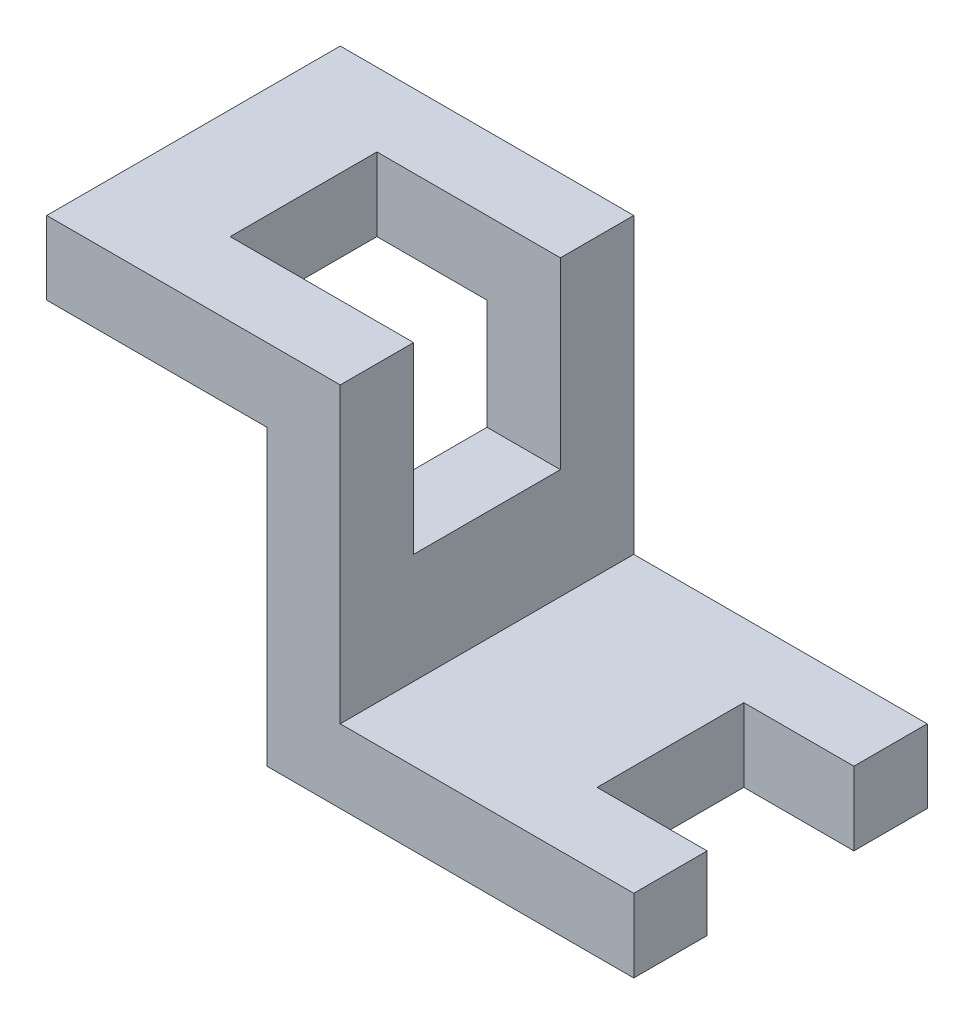
ISO-10303-21;
HEADER;
FILE_DESCRIPTION(('STEP AP214'),'2;1');
FILE_NAME('part.step','',(''),(''),'','','');
FILE_SCHEMA(('AUTOMOTIVE_DESIGN { 1 0 10303 214 1 1 1 1 }'));
ENDSEC;
DATA;
#1=APPLICATION_CONTEXT('core data for automotive mechanical design processes');
#2=APPLICATION_PROTOCOL_DEFINITION('international standard','automotive_design',2000,#1);
#3=PRODUCT_CONTEXT('',#1,'mechanical');
#4=PRODUCT('Part','Part','',(#3));
#5=PRODUCT_RELATED_PRODUCT_CATEGORY('part','',(#4));
#6=PRODUCT_DEFINITION_FORMATION('','',#4);
#7=PRODUCT_DEFINITION_CONTEXT('part definition',#1,'design');
#8=PRODUCT_DEFINITION('design','',#6,#7);
#9=PRODUCT_DEFINITION_SHAPE('','',#8);
#10=(LENGTH_UNIT() NAMED_UNIT(*) SI_UNIT(.MILLI.,.METRE.));
#11=(NAMED_UNIT(*) PLANE_ANGLE_UNIT() SI_UNIT($,.RADIAN.));
#12=(NAMED_UNIT(*) SI_UNIT($,.STERADIAN.) SOLID_ANGLE_UNIT());
#13=UNCERTAINTY_MEASURE_WITH_UNIT(LENGTH_MEASURE(1.E-05),#10,'distance_accuracy_value','');
#14=(GEOMETRIC_REPRESENTATION_CONTEXT(3) GLOBAL_UNCERTAINTY_ASSIGNED_CONTEXT((#13)) GLOBAL_UNIT_ASSIGNED_CONTEXT((#10,
#11,#12)) REPRESENTATION_CONTEXT('',''));
#15=CARTESIAN_POINT('',(0.,0.,0.));
#16=DIRECTION('',(0.,0.,1.));
#17=DIRECTION('',(1.,0.,0.));
#18=AXIS2_PLACEMENT_3D('',#15,#16,#17);
#19=CARTESIAN_POINT('',(-20.7931034482759,72.2758620689655,40.));
#20=DIRECTION('',(0.,1.,0.));
#21=DIRECTION('',(0.,0.,1.));
#22=AXIS2_PLACEMENT_3D('',#19,#20,#21);
#23=PLANE('',#22);
#24=DIRECTION('',(-1.,0.,0.));
#25=VECTOR('',#24,1.);
#26=CARTESIAN_POINT('',(-20.7931034482759,72.2758620689655,30.));
#27=LINE('',#26,#25);
#28=CARTESIAN_POINT('',(-20.7931034482759,72.2758620689655,30.));
#29=VERTEX_POINT('',#28);
#30=CARTESIAN_POINT('',(-35.7931034482759,72.2758620689655,30.));
#31=VERTEX_POINT('',#30);
#32=EDGE_CURVE('E203',#29,#31,#27,.T.);
#33=ORIENTED_EDGE('',*,*,#32,.F.);
#34=DIRECTION('',(0.,0.,-1.));
#35=VECTOR('',#34,1.);
#36=CARTESIAN_POINT('',(-20.7931034482759,72.2758620689655,40.));
#37=LINE('',#36,#35);
#38=CARTESIAN_POINT('',(-20.7931034482759,72.2758620689655,40.));
#39=VERTEX_POINT('',#38);
#40=EDGE_CURVE('E41',#39,#29,#37,.T.);
#41=ORIENTED_EDGE('',*,*,#40,.F.);
#42=DIRECTION('',(1.,0.,0.));
#43=VECTOR('',#42,1.);
#44=CARTESIAN_POINT('',(-20.7931034482759,72.2758620689655,40.));
#45=LINE('',#44,#43);
#46=CARTESIAN_POINT('',(-50.7931034482759,72.2758620689655,40.));
#47=VERTEX_POINT('',#46);
#48=EDGE_CURVE('E236',#47,#39,#45,.T.);
#49=ORIENTED_EDGE('',*,*,#48,.F.);
#50=DIRECTION('',(0.,0.,-1.));
#51=VECTOR('',#50,1.);
#52=CARTESIAN_POINT('',(-50.7931034482759,72.2758620689655,40.));
#53=LINE('',#52,#51);
#54=CARTESIAN_POINT('',(-50.7931034482759,72.2758620689655,0.));
#55=VERTEX_POINT('',#54);
#56=EDGE_CURVE('E11',#47,#55,#53,.T.);
#57=ORIENTED_EDGE('',*,*,#56,.T.);
#58=DIRECTION('',(1.,0.,0.));
#59=VECTOR('',#58,1.);
#60=CARTESIAN_POINT('',(-20.7931034482759,72.2758620689655,0.));
#61=LINE('',#60,#59);
#62=CARTESIAN_POINT('',(-20.7931034482759,72.2758620689655,0.));
#63=VERTEX_POINT('',#62);
#64=EDGE_CURVE('E254',#55,#63,#61,.T.);
#65=ORIENTED_EDGE('',*,*,#64,.T.);
#66=CARTESIAN_POINT('',(-20.7931034482759,72.2758620689655,10.));
#67=VERTEX_POINT('',#66);
#68=EDGE_CURVE('E289',#67,#63,#37,.T.);
#69=ORIENTED_EDGE('',*,*,#68,.F.);
#70=DIRECTION('',(-1.,0.,0.));
#71=VECTOR('',#70,1.);
#72=CARTESIAN_POINT('',(-20.7931034482759,72.2758620689655,10.));
#73=LINE('',#72,#71);
#74=CARTESIAN_POINT('',(-35.7931034482759,72.2758620689655,10.));
#75=VERTEX_POINT('',#74);
#76=EDGE_CURVE('E195',#67,#75,#73,.T.);
#77=ORIENTED_EDGE('',*,*,#76,.T.);
#78=DIRECTION('',(0.,0.,1.));
#79=VECTOR('',#78,1.);
#80=CARTESIAN_POINT('',(-35.7931034482759,72.2758620689655,40.));
#81=LINE('',#80,#79);
#82=EDGE_CURVE('E198',#75,#31,#81,.T.);
#83=ORIENTED_EDGE('',*,*,#82,.T.);
#84=EDGE_LOOP('',(#33,#41,#49,#57,#65,#69,#77,#83));
#85=FACE_BOUND('',#84,.T.);
#86=ADVANCED_FACE('F33',(#85),#23,.F.);
#87=CARTESIAN_POINT('',(-20.7931034482759,32.2758620689655,40.));
#88=DIRECTION('',(1.,0.,0.));
#89=DIRECTION('',(0.,0.,-1.));
#90=AXIS2_PLACEMENT_3D('',#87,#88,#89);
#91=PLANE('',#90);
#92=DIRECTION('',(0.,1.,0.));
#93=VECTOR('',#92,1.);
#94=CARTESIAN_POINT('',(-20.7931034482759,32.2758620689655,30.));
#95=LINE('',#94,#93);
#96=CARTESIAN_POINT('',(-20.7931034482759,57.2758620689655,30.));
#97=VERTEX_POINT('',#96);
#98=EDGE_CURVE('E201',#97,#29,#95,.T.);
#99=ORIENTED_EDGE('',*,*,#98,.F.);
#100=DIRECTION('',(0.,0.,1.));
#101=VECTOR('',#100,1.);
#102=CARTESIAN_POINT('',(-20.7931034482759,57.2758620689655,40.));
#103=LINE('',#102,#101);
#104=CARTESIAN_POINT('',(-20.7931034482759,57.2758620689655,10.));
#105=VERTEX_POINT('',#104);
#106=EDGE_CURVE('E174',#105,#97,#103,.T.);
#107=ORIENTED_EDGE('',*,*,#106,.F.);
#108=DIRECTION('',(0.,1.,0.));
#109=VECTOR('',#108,1.);
#110=CARTESIAN_POINT('',(-20.7931034482759,32.2758620689655,10.));
#111=LINE('',#110,#109);
#112=EDGE_CURVE('E189',#105,#67,#111,.T.);
#113=ORIENTED_EDGE('',*,*,#112,.T.);
#114=ORIENTED_EDGE('',*,*,#68,.T.);
#115=DIRECTION('',(0.,-1.,0.));
#116=VECTOR('',#115,1.);
#117=CARTESIAN_POINT('',(-20.7931034482759,32.2758620689655,0.));
#118=LINE('',#117,#116);
#119=CARTESIAN_POINT('',(-20.7931034482759,32.2758620689655,0.));
#120=VERTEX_POINT('',#119);
#121=EDGE_CURVE('E257',#63,#120,#118,.T.);
#122=ORIENTED_EDGE('',*,*,#121,.T.);
#123=DIRECTION('',(0.,0.,-1.));
#124=VECTOR('',#123,1.);
#125=CARTESIAN_POINT('',(-20.7931034482759,32.2758620689655,40.));
#126=LINE('',#125,#124);
#127=CARTESIAN_POINT('',(-20.7931034482759,32.2758620689655,40.));
#128=VERTEX_POINT('',#127);
#129=EDGE_CURVE('E287',#128,#120,#126,.T.);
#130=ORIENTED_EDGE('',*,*,#129,.F.);
#131=DIRECTION('',(0.,-1.,0.));
#132=VECTOR('',#131,1.);
#133=CARTESIAN_POINT('',(-20.7931034482759,32.2758620689655,40.));
#134=LINE('',#133,#132);
#135=EDGE_CURVE('E239',#39,#128,#134,.T.);
#136=ORIENTED_EDGE('',*,*,#135,.F.);
#137=ORIENTED_EDGE('',*,*,#40,.T.);
#138=EDGE_LOOP('',(#99,#107,#113,#114,#122,#130,#136,#137));
#139=FACE_BOUND('',#138,.T.);
#140=ADVANCED_FACE('F295',(#139),#91,.F.);
#141=CARTESIAN_POINT('',(-10.7931034482759,82.2758620689655,40.));
#142=DIRECTION('',(-1.,0.,0.));
#143=DIRECTION('',(0.,-1.,0.));
#144=AXIS2_PLACEMENT_3D('',#141,#142,#143);
#145=PLANE('',#144);
#146=DIRECTION('',(0.,1.,0.));
#147=VECTOR('',#146,1.);
#148=CARTESIAN_POINT('',(-10.7931034482759,57.2758620689655,30.));
#149=LINE('',#148,#147);
#150=CARTESIAN_POINT('',(-10.7931034482759,57.2758620689655,30.));
#151=VERTEX_POINT('',#150);
#152=CARTESIAN_POINT('',(-10.7931034482759,82.2758620689655,30.));
#153=VERTEX_POINT('',#152);
#154=EDGE_CURVE('E159',#151,#153,#149,.T.);
#155=ORIENTED_EDGE('',*,*,#154,.T.);
#156=DIRECTION('',(0.,0.,-1.));
#157=VECTOR('',#156,1.);
#158=CARTESIAN_POINT('',(-10.7931034482759,82.2758620689655,40.));
#159=LINE('',#158,#157);
#160=CARTESIAN_POINT('',(-10.7931034482759,82.2758620689655,40.));
#161=VERTEX_POINT('',#160);
#162=EDGE_CURVE('E274',#161,#153,#159,.T.);
#163=ORIENTED_EDGE('',*,*,#162,.F.);
#164=DIRECTION('',(0.,1.,0.));
#165=VECTOR('',#164,1.);
#166=CARTESIAN_POINT('',(-10.7931034482759,82.2758620689655,40.));
#167=LINE('',#166,#165);
#168=CARTESIAN_POINT('',(-10.7931034482759,42.2758620689655,40.));
#169=VERTEX_POINT('',#168);
#170=EDGE_CURVE('E247',#169,#161,#167,.T.);
#171=ORIENTED_EDGE('',*,*,#170,.F.);
#172=DIRECTION('',(0.,0.,-1.));
#173=VECTOR('',#172,1.);
#174=CARTESIAN_POINT('',(-10.7931034482759,42.2758620689655,40.));
#175=LINE('',#174,#173);
#176=CARTESIAN_POINT('',(-10.7931034482759,42.2758620689655,0.));
#177=VERTEX_POINT('',#176);
#178=EDGE_CURVE('E276',#169,#177,#175,.T.);
#179=ORIENTED_EDGE('',*,*,#178,.T.);
#180=DIRECTION('',(0.,1.,0.));
#181=VECTOR('',#180,1.);
#182=CARTESIAN_POINT('',(-10.7931034482759,82.2758620689655,0.));
#183=LINE('',#182,#181);
#184=CARTESIAN_POINT('',(-10.7931034482759,82.2758620689655,0.));
#185=VERTEX_POINT('',#184);
#186=EDGE_CURVE('E267',#177,#185,#183,.T.);
#187=ORIENTED_EDGE('',*,*,#186,.T.);
#188=CARTESIAN_POINT('',(-10.7931034482759,82.2758620689655,10.));
#189=VERTEX_POINT('',#188);
#190=EDGE_CURVE('E273',#189,#185,#159,.T.);
#191=ORIENTED_EDGE('',*,*,#190,.F.);
#192=DIRECTION('',(0.,1.,0.));
#193=VECTOR('',#192,1.);
#194=CARTESIAN_POINT('',(-10.7931034482759,57.2758620689655,10.));
#195=LINE('',#194,#193);
#196=CARTESIAN_POINT('',(-10.7931034482759,57.2758620689655,10.));
#197=VERTEX_POINT('',#196);
#198=EDGE_CURVE('E55',#197,#189,#195,.T.);
#199=ORIENTED_EDGE('',*,*,#198,.F.);
#200=DIRECTION('',(0.,0.,-1.));
#201=VECTOR('',#200,1.);
#202=CARTESIAN_POINT('',(-10.7931034482759,57.2758620689655,0.));
#203=LINE('',#202,#201);
#204=EDGE_CURVE('E172',#151,#197,#203,.T.);
#205=ORIENTED_EDGE('',*,*,#204,.F.);
#206=EDGE_LOOP('',(#155,#163,#171,#179,#187,#191,#199,#205));
#207=FACE_BOUND('',#206,.T.);
#208=ADVANCED_FACE('F177',(#207),#145,.F.);
#209=CARTESIAN_POINT('',(-50.7931034482759,82.2758620689655,40.));
#210=DIRECTION('',(0.,-1.,0.));
#211=DIRECTION('',(0.,0.,-1.));
#212=AXIS2_PLACEMENT_3D('',#209,#210,#211);
#213=PLANE('',#212);
#214=DIRECTION('',(-1.,0.,0.));
#215=VECTOR('',#214,1.);
#216=CARTESIAN_POINT('',(0.,82.2758620689655,30.));
#217=LINE('',#216,#215);
#218=CARTESIAN_POINT('',(-35.7931034482759,82.2758620689655,30.));
#219=VERTEX_POINT('',#218);
#220=EDGE_CURVE('E165',#153,#219,#217,.T.);
#221=ORIENTED_EDGE('',*,*,#220,.T.);
#222=DIRECTION('',(0.,0.,1.));
#223=VECTOR('',#222,1.);
#224=CARTESIAN_POINT('',(-35.7931034482759,82.2758620689655,0.));
#225=LINE('',#224,#223);
#226=CARTESIAN_POINT('',(-35.7931034482759,82.2758620689655,10.));
#227=VERTEX_POINT('',#226);
#228=EDGE_CURVE('E175',#227,#219,#225,.T.);
#229=ORIENTED_EDGE('',*,*,#228,.F.);
#230=DIRECTION('',(-1.,0.,0.));
#231=VECTOR('',#230,1.);
#232=CARTESIAN_POINT('',(0.,82.2758620689655,10.));
#233=LINE('',#232,#231);
#234=EDGE_CURVE('E183',#189,#227,#233,.T.);
#235=ORIENTED_EDGE('',*,*,#234,.F.);
#236=ORIENTED_EDGE('',*,*,#190,.T.);
#237=DIRECTION('',(-1.,0.,0.));
#238=VECTOR('',#237,1.);
#239=CARTESIAN_POINT('',(-50.7931034482759,82.2758620689655,0.));
#240=LINE('',#239,#238);
#241=CARTESIAN_POINT('',(-50.7931034482759,82.2758620689655,0.));
#242=VERTEX_POINT('',#241);
#243=EDGE_CURVE('E237',#185,#242,#240,.T.);
#244=ORIENTED_EDGE('',*,*,#243,.T.);
#245=DIRECTION('',(0.,0.,-1.));
#246=VECTOR('',#245,1.);
#247=CARTESIAN_POINT('',(-50.7931034482759,82.2758620689655,40.));
#248=LINE('',#247,#246);
#249=CARTESIAN_POINT('',(-50.7931034482759,82.2758620689655,40.));
#250=VERTEX_POINT('',#249);
#251=EDGE_CURVE('E251',#250,#242,#248,.T.);
#252=ORIENTED_EDGE('',*,*,#251,.F.);
#253=DIRECTION('',(-1.,0.,0.));
#254=VECTOR('',#253,1.);
#255=CARTESIAN_POINT('',(-50.7931034482759,82.2758620689655,40.));
#256=LINE('',#255,#254);
#257=EDGE_CURVE('E249',#161,#250,#256,.T.);
#258=ORIENTED_EDGE('',*,*,#257,.F.);
#259=ORIENTED_EDGE('',*,*,#162,.T.);
#260=EDGE_LOOP('',(#221,#229,#235,#236,#244,#252,#258,#259));
#261=FACE_BOUND('',#260,.T.);
#262=ADVANCED_FACE('F321',(#261),#213,.F.);
#263=CARTESIAN_POINT('',(29.2068965517241,42.2758620689655,40.));
#264=DIRECTION('',(-1.,0.,0.));
#265=DIRECTION('',(0.,0.,1.));
#266=AXIS2_PLACEMENT_3D('',#263,#264,#265);
#267=PLANE('',#266);
#268=DIRECTION('',(0.,0.,-1.));
#269=VECTOR('',#268,1.);
#270=CARTESIAN_POINT('',(29.2068965517241,32.2758620689655,40.));
#271=LINE('',#270,#269);
#272=CARTESIAN_POINT('',(29.2068965517241,32.2758620689655,40.));
#273=VERTEX_POINT('',#272);
#274=CARTESIAN_POINT('',(29.2068965517241,32.2758620689655,30.));
#275=VERTEX_POINT('',#274);
#276=EDGE_CURVE('E284',#273,#275,#271,.T.);
#277=ORIENTED_EDGE('',*,*,#276,.T.);
#278=DIRECTION('',(0.,1.,0.));
#279=VECTOR('',#278,1.);
#280=CARTESIAN_POINT('',(29.2068965517241,2.27586206896551,30.));
#281=LINE('',#280,#279);
#282=CARTESIAN_POINT('',(29.2068965517241,42.2758620689655,30.));
#283=VERTEX_POINT('',#282);
#284=EDGE_CURVE('E215',#275,#283,#281,.T.);
#285=ORIENTED_EDGE('',*,*,#284,.T.);
#286=DIRECTION('',(0.,0.,-1.));
#287=VECTOR('',#286,1.);
#288=CARTESIAN_POINT('',(29.2068965517241,42.2758620689655,40.));
#289=LINE('',#288,#287);
#290=CARTESIAN_POINT('',(29.2068965517241,42.2758620689655,40.));
#291=VERTEX_POINT('',#290);
#292=EDGE_CURVE('E280',#291,#283,#289,.T.);
#293=ORIENTED_EDGE('',*,*,#292,.F.);
#294=DIRECTION('',(0.,1.,0.));
#295=VECTOR('',#294,1.);
#296=CARTESIAN_POINT('',(29.2068965517241,42.2758620689655,40.));
#297=LINE('',#296,#295);
#298=EDGE_CURVE('E243',#273,#291,#297,.T.);
#299=ORIENTED_EDGE('',*,*,#298,.F.);
#300=EDGE_LOOP('',(#277,#285,#293,#299));
#301=FACE_BOUND('',#300,.T.);
#302=ADVANCED_FACE('F355',(#301),#267,.F.);
#303=CARTESIAN_POINT('',(-50.7931034482759,72.2758620689655,40.));
#304=DIRECTION('',(1.,0.,0.));
#305=DIRECTION('',(0.,1.,0.));
#306=AXIS2_PLACEMENT_3D('',#303,#304,#305);
#307=PLANE('',#306);
#308=DIRECTION('',(0.,-1.,0.));
#309=VECTOR('',#308,1.);
#310=CARTESIAN_POINT('',(-50.7931034482759,72.2758620689655,0.));
#311=LINE('',#310,#309);
#312=EDGE_CURVE('E232',#242,#55,#311,.T.);
#313=ORIENTED_EDGE('',*,*,#312,.T.);
#314=ORIENTED_EDGE('',*,*,#56,.F.);
#315=DIRECTION('',(0.,-1.,0.));
#316=VECTOR('',#315,1.);
#317=CARTESIAN_POINT('',(-50.7931034482759,72.2758620689655,40.));
#318=LINE('',#317,#316);
#319=EDGE_CURVE('E233',#250,#47,#318,.T.);
#320=ORIENTED_EDGE('',*,*,#319,.F.);
#321=ORIENTED_EDGE('',*,*,#251,.T.);
#322=EDGE_LOOP('',(#313,#314,#320,#321));
#323=FACE_BOUND('',#322,.T.);
#324=ADVANCED_FACE('F35',(#323),#307,.F.);
#325=CARTESIAN_POINT('',(29.2068965517241,32.2758620689655,40.));
#326=DIRECTION('',(0.,1.,0.));
#327=DIRECTION('',(0.,0.,1.));
#328=AXIS2_PLACEMENT_3D('',#325,#326,#327);
#329=PLANE('',#328);
#330=DIRECTION('',(0.,0.,1.));
#331=VECTOR('',#330,1.);
#332=CARTESIAN_POINT('',(14.2068965517241,32.2758620689655,40.));
#333=LINE('',#332,#331);
#334=CARTESIAN_POINT('',(14.2068965517241,32.2758620689655,10.));
#335=VERTEX_POINT('',#334);
#336=CARTESIAN_POINT('',(14.2068965517241,32.2758620689655,30.));
#337=VERTEX_POINT('',#336);
#338=EDGE_CURVE('E226',#335,#337,#333,.T.);
#339=ORIENTED_EDGE('',*,*,#338,.T.);
#340=DIRECTION('',(1.,0.,0.));
#341=VECTOR('',#340,1.);
#342=CARTESIAN_POINT('',(29.2068965517241,32.2758620689655,30.));
#343=LINE('',#342,#341);
#344=EDGE_CURVE('E229',#337,#275,#343,.T.);
#345=ORIENTED_EDGE('',*,*,#344,.T.);
#346=ORIENTED_EDGE('',*,*,#276,.F.);
#347=DIRECTION('',(1.,0.,0.));
#348=VECTOR('',#347,1.);
#349=CARTESIAN_POINT('',(29.2068965517241,32.2758620689655,40.));
#350=LINE('',#349,#348);
#351=EDGE_CURVE('E241',#128,#273,#350,.T.);
#352=ORIENTED_EDGE('',*,*,#351,.F.);
#353=ORIENTED_EDGE('',*,*,#129,.T.);
#354=DIRECTION('',(1.,0.,0.));
#355=VECTOR('',#354,1.);
#356=CARTESIAN_POINT('',(29.2068965517241,32.2758620689655,0.));
#357=LINE('',#356,#355);
#358=CARTESIAN_POINT('',(29.2068965517241,32.2758620689655,0.));
#359=VERTEX_POINT('',#358);
#360=EDGE_CURVE('E259',#120,#359,#357,.T.);
#361=ORIENTED_EDGE('',*,*,#360,.T.);
#362=CARTESIAN_POINT('',(29.2068965517241,32.2758620689655,10.));
#363=VERTEX_POINT('',#362);
#364=EDGE_CURVE('E283',#363,#359,#271,.T.);
#365=ORIENTED_EDGE('',*,*,#364,.F.);
#366=DIRECTION('',(-1.,0.,0.));
#367=VECTOR('',#366,1.);
#368=CARTESIAN_POINT('',(29.2068965517241,32.2758620689655,10.));
#369=LINE('',#368,#367);
#370=EDGE_CURVE('E218',#363,#335,#369,.T.);
#371=ORIENTED_EDGE('',*,*,#370,.T.);
#372=EDGE_LOOP('',(#339,#345,#346,#352,#353,#361,#365,#371));
#373=FACE_BOUND('',#372,.T.);
#374=ADVANCED_FACE('F309',(#373),#329,.F.);
#375=CARTESIAN_POINT('',(29.2068965517241,42.2758620689655,10.));
#376=VERTEX_POINT('',#375);
#377=CARTESIAN_POINT('',(29.2068965517241,42.2758620689655,0.));
#378=VERTEX_POINT('',#377);
#379=EDGE_CURVE('E279',#376,#378,#289,.T.);
#380=ORIENTED_EDGE('',*,*,#379,.F.);
#381=DIRECTION('',(0.,1.,0.));
#382=VECTOR('',#381,1.);
#383=CARTESIAN_POINT('',(29.2068965517241,2.27586206896551,10.));
#384=LINE('',#383,#382);
#385=EDGE_CURVE('E214',#363,#376,#384,.T.);
#386=ORIENTED_EDGE('',*,*,#385,.F.);
#387=ORIENTED_EDGE('',*,*,#364,.T.);
#388=DIRECTION('',(0.,1.,0.));
#389=VECTOR('',#388,1.);
#390=CARTESIAN_POINT('',(29.2068965517241,42.2758620689655,0.));
#391=LINE('',#390,#389);
#392=EDGE_CURVE('E262',#359,#378,#391,.T.);
#393=ORIENTED_EDGE('',*,*,#392,.T.);
#394=EDGE_LOOP('',(#380,#386,#387,#393));
#395=FACE_BOUND('',#394,.T.);
#396=ADVANCED_FACE('F351',(#395),#267,.F.);
#397=CARTESIAN_POINT('',(-10.7931034482759,42.2758620689655,40.));
#398=DIRECTION('',(0.,-1.,0.));
#399=DIRECTION('',(0.,0.,-1.));
#400=AXIS2_PLACEMENT_3D('',#397,#398,#399);
#401=PLANE('',#400);
#402=ORIENTED_EDGE('',*,*,#292,.T.);
#403=DIRECTION('',(1.,0.,0.));
#404=VECTOR('',#403,1.);
#405=CARTESIAN_POINT('',(14.2068965517241,42.2758620689655,30.));
#406=LINE('',#405,#404);
#407=CARTESIAN_POINT('',(14.2068965517241,42.2758620689655,30.));
#408=VERTEX_POINT('',#407);
#409=EDGE_CURVE('E212',#408,#283,#406,.T.);
#410=ORIENTED_EDGE('',*,*,#409,.F.);
#411=DIRECTION('',(0.,0.,1.));
#412=VECTOR('',#411,1.);
#413=CARTESIAN_POINT('',(14.2068965517241,42.2758620689655,10.));
#414=LINE('',#413,#412);
#415=CARTESIAN_POINT('',(14.2068965517241,42.2758620689655,10.));
#416=VERTEX_POINT('',#415);
#417=EDGE_CURVE('E209',#416,#408,#414,.T.);
#418=ORIENTED_EDGE('',*,*,#417,.F.);
#419=DIRECTION('',(-1.,0.,0.));
#420=VECTOR('',#419,1.);
#421=CARTESIAN_POINT('',(29.2068965517241,42.2758620689655,10.));
#422=LINE('',#421,#420);
#423=EDGE_CURVE('E206',#376,#416,#422,.T.);
#424=ORIENTED_EDGE('',*,*,#423,.F.);
#425=ORIENTED_EDGE('',*,*,#379,.T.);
#426=DIRECTION('',(-1.,0.,0.));
#427=VECTOR('',#426,1.);
#428=CARTESIAN_POINT('',(-10.7931034482759,42.2758620689655,0.));
#429=LINE('',#428,#427);
#430=EDGE_CURVE('E265',#378,#177,#429,.T.);
#431=ORIENTED_EDGE('',*,*,#430,.T.);
#432=ORIENTED_EDGE('',*,*,#178,.F.);
#433=DIRECTION('',(-1.,0.,0.));
#434=VECTOR('',#433,1.);
#435=CARTESIAN_POINT('',(-10.7931034482759,42.2758620689655,40.));
#436=LINE('',#435,#434);
#437=EDGE_CURVE('E245',#291,#169,#436,.T.);
#438=ORIENTED_EDGE('',*,*,#437,.F.);
#439=EDGE_LOOP('',(#402,#410,#418,#424,#425,#431,#432,#438));
#440=FACE_BOUND('',#439,.T.);
#441=ADVANCED_FACE('F331',(#440),#401,.F.);
#442=CARTESIAN_POINT('',(0.,0.,40.));
#443=DIRECTION('',(0.,0.,-1.));
#444=DIRECTION('',(-1.,0.,0.));
#445=AXIS2_PLACEMENT_3D('',#442,#443,#444);
#446=PLANE('',#445);
#447=ORIENTED_EDGE('',*,*,#319,.T.);
#448=ORIENTED_EDGE('',*,*,#48,.T.);
#449=ORIENTED_EDGE('',*,*,#135,.T.);
#450=ORIENTED_EDGE('',*,*,#351,.T.);
#451=ORIENTED_EDGE('',*,*,#298,.T.);
#452=ORIENTED_EDGE('',*,*,#437,.T.);
#453=ORIENTED_EDGE('',*,*,#170,.T.);
#454=ORIENTED_EDGE('',*,*,#257,.T.);
#455=EDGE_LOOP('',(#447,#448,#449,#450,#451,#452,#453,#454));
#456=FACE_BOUND('',#455,.T.);
#457=ADVANCED_FACE('F313',(#456),#446,.F.);
#458=CARTESIAN_POINT('',(0.,0.,0.));
#459=DIRECTION('',(0.,0.,-1.));
#460=DIRECTION('',(-1.,0.,0.));
#461=AXIS2_PLACEMENT_3D('',#458,#459,#460);
#462=PLANE('',#461);
#463=ORIENTED_EDGE('',*,*,#312,.F.);
#464=ORIENTED_EDGE('',*,*,#243,.F.);
#465=ORIENTED_EDGE('',*,*,#186,.F.);
#466=ORIENTED_EDGE('',*,*,#430,.F.);
#467=ORIENTED_EDGE('',*,*,#392,.F.);
#468=ORIENTED_EDGE('',*,*,#360,.F.);
#469=ORIENTED_EDGE('',*,*,#121,.F.);
#470=ORIENTED_EDGE('',*,*,#64,.F.);
#471=EDGE_LOOP('',(#463,#464,#465,#466,#467,#468,#469,#470));
#472=FACE_BOUND('',#471,.T.);
#473=ADVANCED_FACE('F304',(#472),#462,.T.);
#474=CARTESIAN_POINT('',(14.2068965517241,2.27586206896551,30.));
#475=DIRECTION('',(0.,0.,1.));
#476=DIRECTION('',(1.,0.,0.));
#477=AXIS2_PLACEMENT_3D('',#474,#475,#476);
#478=PLANE('',#477);
#479=DIRECTION('',(0.,1.,0.));
#480=VECTOR('',#479,1.);
#481=CARTESIAN_POINT('',(14.2068965517241,2.27586206896551,30.));
#482=LINE('',#481,#480);
#483=EDGE_CURVE('E219',#337,#408,#482,.T.);
#484=ORIENTED_EDGE('',*,*,#483,.T.);
#485=ORIENTED_EDGE('',*,*,#409,.T.);
#486=ORIENTED_EDGE('',*,*,#284,.F.);
#487=ORIENTED_EDGE('',*,*,#344,.F.);
#488=EDGE_LOOP('',(#484,#485,#486,#487));
#489=FACE_BOUND('',#488,.T.);
#490=ADVANCED_FACE('F364',(#489),#478,.F.);
#491=CARTESIAN_POINT('',(14.2068965517241,2.27586206896551,10.));
#492=DIRECTION('',(-1.,0.,0.));
#493=DIRECTION('',(0.,0.,1.));
#494=AXIS2_PLACEMENT_3D('',#491,#492,#493);
#495=PLANE('',#494);
#496=DIRECTION('',(0.,1.,0.));
#497=VECTOR('',#496,1.);
#498=CARTESIAN_POINT('',(14.2068965517241,2.27586206896551,10.));
#499=LINE('',#498,#497);
#500=EDGE_CURVE('E221',#335,#416,#499,.T.);
#501=ORIENTED_EDGE('',*,*,#500,.T.);
#502=ORIENTED_EDGE('',*,*,#417,.T.);
#503=ORIENTED_EDGE('',*,*,#483,.F.);
#504=ORIENTED_EDGE('',*,*,#338,.F.);
#505=EDGE_LOOP('',(#501,#502,#503,#504));
#506=FACE_BOUND('',#505,.T.);
#507=ADVANCED_FACE('F370',(#506),#495,.F.);
#508=CARTESIAN_POINT('',(29.2068965517241,2.27586206896551,10.));
#509=DIRECTION('',(0.,0.,-1.));
#510=DIRECTION('',(-1.,0.,0.));
#511=AXIS2_PLACEMENT_3D('',#508,#509,#510);
#512=PLANE('',#511);
#513=ORIENTED_EDGE('',*,*,#385,.T.);
#514=ORIENTED_EDGE('',*,*,#423,.T.);
#515=ORIENTED_EDGE('',*,*,#500,.F.);
#516=ORIENTED_EDGE('',*,*,#370,.F.);
#517=EDGE_LOOP('',(#513,#514,#515,#516));
#518=FACE_BOUND('',#517,.T.);
#519=ADVANCED_FACE('F367',(#518),#512,.F.);
#520=CARTESIAN_POINT('',(0.,57.2758620689655,0.));
#521=DIRECTION('',(0.,1.,0.));
#522=DIRECTION('',(0.,0.,1.));
#523=AXIS2_PLACEMENT_3D('',#520,#521,#522);
#524=PLANE('',#523);
#525=ORIENTED_EDGE('',*,*,#106,.T.);
#526=DIRECTION('',(-1.,0.,0.));
#527=VECTOR('',#526,1.);
#528=CARTESIAN_POINT('',(0.,57.2758620689655,30.));
#529=LINE('',#528,#527);
#530=EDGE_CURVE('E162',#151,#97,#529,.T.);
#531=ORIENTED_EDGE('',*,*,#530,.F.);
#532=ORIENTED_EDGE('',*,*,#204,.T.);
#533=DIRECTION('',(-1.,0.,0.));
#534=VECTOR('',#533,1.);
#535=CARTESIAN_POINT('',(0.,57.2758620689655,10.));
#536=LINE('',#535,#534);
#537=EDGE_CURVE('E48',#197,#105,#536,.T.);
#538=ORIENTED_EDGE('',*,*,#537,.T.);
#539=EDGE_LOOP('',(#525,#531,#532,#538));
#540=FACE_BOUND('',#539,.T.);
#541=ADVANCED_FACE('F171',(#540),#524,.T.);
#542=CARTESIAN_POINT('',(0.,57.2758620689655,30.));
#543=DIRECTION('',(0.,0.,-1.));
#544=DIRECTION('',(-1.,0.,0.));
#545=AXIS2_PLACEMENT_3D('',#542,#543,#544);
#546=PLANE('',#545);
#547=ORIENTED_EDGE('',*,*,#32,.T.);
#548=DIRECTION('',(0.,1.,0.));
#549=VECTOR('',#548,1.);
#550=CARTESIAN_POINT('',(-35.7931034482759,57.2758620689655,30.));
#551=LINE('',#550,#549);
#552=EDGE_CURVE('E187',#31,#219,#551,.T.);
#553=ORIENTED_EDGE('',*,*,#552,.T.);
#554=ORIENTED_EDGE('',*,*,#220,.F.);
#555=ORIENTED_EDGE('',*,*,#154,.F.);
#556=ORIENTED_EDGE('',*,*,#530,.T.);
#557=ORIENTED_EDGE('',*,*,#98,.T.);
#558=EDGE_LOOP('',(#547,#553,#554,#555,#556,#557));
#559=FACE_BOUND('',#558,.T.);
#560=ADVANCED_FACE('F161',(#559),#546,.T.);
#561=CARTESIAN_POINT('',(-35.7931034482759,57.2758620689655,0.));
#562=DIRECTION('',(-1.,0.,0.));
#563=DIRECTION('',(0.,0.,1.));
#564=AXIS2_PLACEMENT_3D('',#561,#562,#563);
#565=PLANE('',#564);
#566=DIRECTION('',(0.,1.,0.));
#567=VECTOR('',#566,1.);
#568=CARTESIAN_POINT('',(-35.7931034482759,57.2758620689655,10.));
#569=LINE('',#568,#567);
#570=EDGE_CURVE('E190',#75,#227,#569,.T.);
#571=ORIENTED_EDGE('',*,*,#570,.T.);
#572=ORIENTED_EDGE('',*,*,#228,.T.);
#573=ORIENTED_EDGE('',*,*,#552,.F.);
#574=ORIENTED_EDGE('',*,*,#82,.F.);
#575=EDGE_LOOP('',(#571,#572,#573,#574));
#576=FACE_BOUND('',#575,.T.);
#577=ADVANCED_FACE('F317',(#576),#565,.F.);
#578=CARTESIAN_POINT('',(0.,57.2758620689655,10.));
#579=DIRECTION('',(0.,0.,-1.));
#580=DIRECTION('',(-1.,0.,0.));
#581=AXIS2_PLACEMENT_3D('',#578,#579,#580);
#582=PLANE('',#581);
#583=ORIENTED_EDGE('',*,*,#112,.F.);
#584=ORIENTED_EDGE('',*,*,#537,.F.);
#585=ORIENTED_EDGE('',*,*,#198,.T.);
#586=ORIENTED_EDGE('',*,*,#234,.T.);
#587=ORIENTED_EDGE('',*,*,#570,.F.);
#588=ORIENTED_EDGE('',*,*,#76,.F.);
#589=EDGE_LOOP('',(#583,#584,#585,#586,#587,#588));
#590=FACE_BOUND('',#589,.T.);
#591=ADVANCED_FACE('F335',(#590),#582,.F.);
#592=CLOSED_SHELL('',(#86,#140,#208,#262,#302,#324,#374,#396,#441,#457,#473,#490,#507,#519,#541,
#560,#577,#591));
#593=MANIFOLD_SOLID_BREP('B2',#592);
#594=ADVANCED_BREP_SHAPE_REPRESENTATION('',(#18,#593),#14);
#595=SHAPE_DEFINITION_REPRESENTATION(#9,#594);
ENDSEC;
END-ISO-10303-21;
